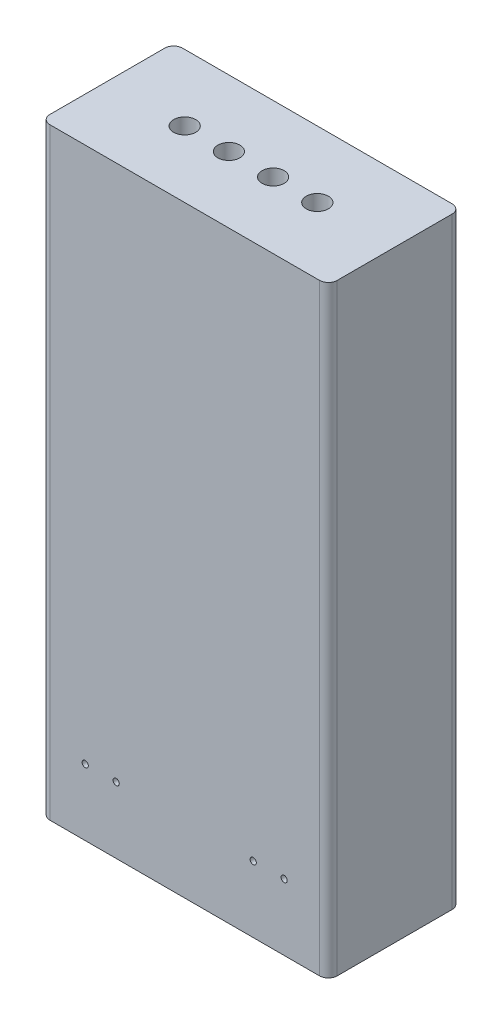
ISO-10303-21;
HEADER;
FILE_DESCRIPTION(('STEP AP214'),'2;1');
FILE_NAME('part.step','',(''),(''),'','','');
FILE_SCHEMA(('AUTOMOTIVE_DESIGN { 1 0 10303 214 1 1 1 1 }'));
ENDSEC;
DATA;
#1=APPLICATION_CONTEXT('core data for automotive mechanical design processes');
#2=APPLICATION_PROTOCOL_DEFINITION('international standard','automotive_design',2000,#1);
#3=PRODUCT_CONTEXT('',#1,'mechanical');
#4=PRODUCT('Part','Part','',(#3));
#5=PRODUCT_RELATED_PRODUCT_CATEGORY('part','',(#4));
#6=PRODUCT_DEFINITION_FORMATION('','',#4);
#7=PRODUCT_DEFINITION_CONTEXT('part definition',#1,'design');
#8=PRODUCT_DEFINITION('design','',#6,#7);
#9=PRODUCT_DEFINITION_SHAPE('','',#8);
#10=(LENGTH_UNIT() NAMED_UNIT(*) SI_UNIT(.MILLI.,.METRE.));
#11=(NAMED_UNIT(*) PLANE_ANGLE_UNIT() SI_UNIT($,.RADIAN.));
#12=(NAMED_UNIT(*) SI_UNIT($,.STERADIAN.) SOLID_ANGLE_UNIT());
#13=UNCERTAINTY_MEASURE_WITH_UNIT(LENGTH_MEASURE(1.E-05),#10,'distance_accuracy_value','');
#14=(GEOMETRIC_REPRESENTATION_CONTEXT(3) GLOBAL_UNCERTAINTY_ASSIGNED_CONTEXT((#13)) GLOBAL_UNIT_ASSIGNED_CONTEXT((#10,
#11,#12)) REPRESENTATION_CONTEXT('',''));
#15=CARTESIAN_POINT('',(0.,0.,0.));
#16=DIRECTION('',(0.,0.,1.));
#17=DIRECTION('',(1.,0.,0.));
#18=AXIS2_PLACEMENT_3D('',#15,#16,#17);
#19=CARTESIAN_POINT('',(41.275,-86.51875,19.05));
#20=DIRECTION('',(-1.,0.,0.));
#21=DIRECTION('',(0.,0.,1.));
#22=AXIS2_PLACEMENT_3D('',#19,#20,#21);
#23=PLANE('',#22);
#24=DIRECTION('',(0.,0.,-1.));
#25=VECTOR('',#24,1.);
#26=CARTESIAN_POINT('',(41.275,-86.51875,19.05));
#27=LINE('',#26,#25);
#28=CARTESIAN_POINT('',(41.275,-86.51875,16.51));
#29=VERTEX_POINT('',#28);
#30=CARTESIAN_POINT('',(41.275,-86.51875,-16.51));
#31=VERTEX_POINT('',#30);
#32=EDGE_CURVE('E167',#29,#31,#27,.T.);
#33=ORIENTED_EDGE('',*,*,#32,.T.);
#34=DIRECTION('',(0.,1.,0.));
#35=VECTOR('',#34,1.);
#36=CARTESIAN_POINT('',(41.275,86.51875,-16.51));
#37=LINE('',#36,#35);
#38=CARTESIAN_POINT('',(41.275,86.51875,-16.51));
#39=VERTEX_POINT('',#38);
#40=EDGE_CURVE('E123',#31,#39,#37,.T.);
#41=ORIENTED_EDGE('',*,*,#40,.T.);
#42=DIRECTION('',(0.,0.,-1.));
#43=VECTOR('',#42,1.);
#44=CARTESIAN_POINT('',(41.275,86.51875,19.05));
#45=LINE('',#44,#43);
#46=CARTESIAN_POINT('',(41.275,86.51875,16.51));
#47=VERTEX_POINT('',#46);
#48=EDGE_CURVE('E107',#47,#39,#45,.T.);
#49=ORIENTED_EDGE('',*,*,#48,.F.);
#50=DIRECTION('',(0.,1.,0.));
#51=VECTOR('',#50,1.);
#52=CARTESIAN_POINT('',(41.275,-86.51875,16.51));
#53=LINE('',#52,#51);
#54=EDGE_CURVE('E120',#47,#29,#53,.F.);
#55=ORIENTED_EDGE('',*,*,#54,.T.);
#56=EDGE_LOOP('',(#33,#41,#49,#55));
#57=FACE_BOUND('',#56,.T.);
#58=ADVANCED_FACE('F38',(#57),#23,.F.);
#59=CARTESIAN_POINT('',(-41.275,86.51875,19.05));
#60=DIRECTION('',(0.,-1.,0.));
#61=DIRECTION('',(0.,0.,-1.));
#62=AXIS2_PLACEMENT_3D('',#59,#60,#61);
#63=PLANE('',#62);
#64=CARTESIAN_POINT('',(-19.05,86.51875,0.));
#65=DIRECTION('',(0.,1.,0.));
#66=DIRECTION('',(0.,0.,1.));
#67=AXIS2_PLACEMENT_3D('',#64,#65,#66);
#68=CIRCLE('',#67,3.175);
#69=CARTESIAN_POINT('',(-19.05,86.51875,3.175));
#70=VERTEX_POINT('',#69);
#71=EDGE_CURVE('E378',#70,#70,#68,.T.);
#72=ORIENTED_EDGE('',*,*,#71,.F.);
#73=EDGE_LOOP('',(#72));
#74=FACE_BOUND('',#73,.T.);
#75=CARTESIAN_POINT('',(-6.35,86.51875,0.));
#76=DIRECTION('',(0.,1.,0.));
#77=DIRECTION('',(0.,0.,1.));
#78=AXIS2_PLACEMENT_3D('',#75,#76,#77);
#79=CIRCLE('',#78,3.175);
#80=CARTESIAN_POINT('',(-6.35,86.51875,3.175));
#81=VERTEX_POINT('',#80);
#82=EDGE_CURVE('E389',#81,#81,#79,.T.);
#83=ORIENTED_EDGE('',*,*,#82,.F.);
#84=EDGE_LOOP('',(#83));
#85=FACE_BOUND('',#84,.T.);
#86=CARTESIAN_POINT('',(6.35,86.51875,0.));
#87=DIRECTION('',(0.,1.,0.));
#88=DIRECTION('',(0.,0.,1.));
#89=AXIS2_PLACEMENT_3D('',#86,#87,#88);
#90=CIRCLE('',#89,3.175);
#91=CARTESIAN_POINT('',(6.35,86.51875,3.175));
#92=VERTEX_POINT('',#91);
#93=EDGE_CURVE('E395',#92,#92,#90,.T.);
#94=ORIENTED_EDGE('',*,*,#93,.F.);
#95=EDGE_LOOP('',(#94));
#96=FACE_BOUND('',#95,.T.);
#97=CARTESIAN_POINT('',(19.05,86.51875,0.));
#98=DIRECTION('',(0.,1.,0.));
#99=DIRECTION('',(0.,0.,1.));
#100=AXIS2_PLACEMENT_3D('',#97,#98,#99);
#101=CIRCLE('',#100,3.175);
#102=CARTESIAN_POINT('',(19.05,86.51875,3.175));
#103=VERTEX_POINT('',#102);
#104=EDGE_CURVE('E377',#103,#103,#101,.T.);
#105=ORIENTED_EDGE('',*,*,#104,.F.);
#106=EDGE_LOOP('',(#105));
#107=FACE_BOUND('',#106,.T.);
#108=ORIENTED_EDGE('',*,*,#48,.T.);
#109=CARTESIAN_POINT('',(38.735,86.51875,-16.51));
#110=DIRECTION('',(0.,-1.,0.));
#111=DIRECTION('',(0.,0.,-1.));
#112=AXIS2_PLACEMENT_3D('',#109,#110,#111);
#113=CIRCLE('',#112,2.54);
#114=CARTESIAN_POINT('',(38.735,86.51875,-19.05));
#115=VERTEX_POINT('',#114);
#116=EDGE_CURVE('E114',#39,#115,#113,.F.);
#117=ORIENTED_EDGE('',*,*,#116,.T.);
#118=DIRECTION('',(-1.,0.,0.));
#119=VECTOR('',#118,1.);
#120=CARTESIAN_POINT('',(-41.275,86.51875,-19.05));
#121=LINE('',#120,#119);
#122=CARTESIAN_POINT('',(-38.735,86.51875,-19.05));
#123=VERTEX_POINT('',#122);
#124=EDGE_CURVE('E174',#115,#123,#121,.T.);
#125=ORIENTED_EDGE('',*,*,#124,.T.);
#126=CARTESIAN_POINT('',(-38.735,86.51875,-16.51));
#127=DIRECTION('',(0.,-1.,0.));
#128=DIRECTION('',(0.,0.,-1.));
#129=AXIS2_PLACEMENT_3D('',#126,#127,#128);
#130=CIRCLE('',#129,2.54);
#131=CARTESIAN_POINT('',(-41.275,86.51875,-16.51));
#132=VERTEX_POINT('',#131);
#133=EDGE_CURVE('E115',#123,#132,#130,.F.);
#134=ORIENTED_EDGE('',*,*,#133,.T.);
#135=DIRECTION('',(0.,0.,-1.));
#136=VECTOR('',#135,1.);
#137=CARTESIAN_POINT('',(-41.275,86.51875,19.05));
#138=LINE('',#137,#136);
#139=CARTESIAN_POINT('',(-41.275,86.51875,16.51));
#140=VERTEX_POINT('',#139);
#141=EDGE_CURVE('E124',#140,#132,#138,.T.);
#142=ORIENTED_EDGE('',*,*,#141,.F.);
#143=CARTESIAN_POINT('',(-38.735,86.51875,16.51));
#144=DIRECTION('',(0.,-1.,0.));
#145=DIRECTION('',(0.,0.,-1.));
#146=AXIS2_PLACEMENT_3D('',#143,#144,#145);
#147=CIRCLE('',#146,2.54);
#148=CARTESIAN_POINT('',(-38.735,86.51875,19.05));
#149=VERTEX_POINT('',#148);
#150=EDGE_CURVE('E130',#140,#149,#147,.F.);
#151=ORIENTED_EDGE('',*,*,#150,.T.);
#152=DIRECTION('',(-1.,0.,0.));
#153=VECTOR('',#152,1.);
#154=CARTESIAN_POINT('',(-41.275,86.51875,19.05));
#155=LINE('',#154,#153);
#156=CARTESIAN_POINT('',(38.735,86.51875,19.05));
#157=VERTEX_POINT('',#156);
#158=EDGE_CURVE('E109',#157,#149,#155,.T.);
#159=ORIENTED_EDGE('',*,*,#158,.F.);
#160=CARTESIAN_POINT('',(38.735,86.51875,16.51));
#161=DIRECTION('',(0.,-1.,0.));
#162=DIRECTION('',(0.,0.,-1.));
#163=AXIS2_PLACEMENT_3D('',#160,#161,#162);
#164=CIRCLE('',#163,2.54);
#165=EDGE_CURVE('E104',#157,#47,#164,.F.);
#166=ORIENTED_EDGE('',*,*,#165,.T.);
#167=EDGE_LOOP('',(#108,#117,#125,#134,#142,#151,#159,#166));
#168=FACE_BOUND('',#167,.T.);
#169=ADVANCED_FACE('F106',(#74,#85,#96,#107,#168),#63,.F.);
#170=CARTESIAN_POINT('',(-41.275,-86.51875,19.05));
#171=DIRECTION('',(1.,0.,0.));
#172=DIRECTION('',(0.,0.,-1.));
#173=AXIS2_PLACEMENT_3D('',#170,#171,#172);
#174=PLANE('',#173);
#175=ORIENTED_EDGE('',*,*,#141,.T.);
#176=DIRECTION('',(0.,-1.,0.));
#177=VECTOR('',#176,1.);
#178=CARTESIAN_POINT('',(-41.275,-86.51875,-16.51));
#179=LINE('',#178,#177);
#180=CARTESIAN_POINT('',(-41.275,-86.51875,-16.51));
#181=VERTEX_POINT('',#180);
#182=EDGE_CURVE('E11',#132,#181,#179,.T.);
#183=ORIENTED_EDGE('',*,*,#182,.T.);
#184=DIRECTION('',(0.,0.,-1.));
#185=VECTOR('',#184,1.);
#186=CARTESIAN_POINT('',(-41.275,-86.51875,19.05));
#187=LINE('',#186,#185);
#188=CARTESIAN_POINT('',(-41.275,-86.51875,16.51));
#189=VERTEX_POINT('',#188);
#190=EDGE_CURVE('E155',#189,#181,#187,.T.);
#191=ORIENTED_EDGE('',*,*,#190,.F.);
#192=DIRECTION('',(0.,-1.,0.));
#193=VECTOR('',#192,1.);
#194=CARTESIAN_POINT('',(-41.275,-86.51875,16.51));
#195=LINE('',#194,#193);
#196=EDGE_CURVE('E46',#189,#140,#195,.F.);
#197=ORIENTED_EDGE('',*,*,#196,.T.);
#198=EDGE_LOOP('',(#175,#183,#191,#197));
#199=FACE_BOUND('',#198,.T.);
#200=ADVANCED_FACE('F154',(#199),#174,.F.);
#201=CARTESIAN_POINT('',(-41.275,-86.51875,19.05));
#202=DIRECTION('',(0.,1.,0.));
#203=DIRECTION('',(0.,0.,1.));
#204=AXIS2_PLACEMENT_3D('',#201,#202,#203);
#205=PLANE('',#204);
#206=DIRECTION('',(1.,0.,0.));
#207=VECTOR('',#206,1.);
#208=CARTESIAN_POINT('',(-41.275,-86.51875,-19.05));
#209=LINE('',#208,#207);
#210=CARTESIAN_POINT('',(-38.735,-86.51875,-19.05));
#211=VERTEX_POINT('',#210);
#212=CARTESIAN_POINT('',(38.735,-86.51875,-19.05));
#213=VERTEX_POINT('',#212);
#214=EDGE_CURVE('E170',#211,#213,#209,.T.);
#215=ORIENTED_EDGE('',*,*,#214,.T.);
#216=CARTESIAN_POINT('',(38.735,-86.51875,-16.51));
#217=DIRECTION('',(0.,1.,0.));
#218=DIRECTION('',(0.,0.,1.));
#219=AXIS2_PLACEMENT_3D('',#216,#217,#218);
#220=CIRCLE('',#219,2.54);
#221=EDGE_CURVE('E144',#213,#31,#220,.F.);
#222=ORIENTED_EDGE('',*,*,#221,.T.);
#223=ORIENTED_EDGE('',*,*,#32,.F.);
#224=CARTESIAN_POINT('',(38.735,-86.51875,16.51));
#225=DIRECTION('',(0.,1.,0.));
#226=DIRECTION('',(0.,0.,1.));
#227=AXIS2_PLACEMENT_3D('',#224,#225,#226);
#228=CIRCLE('',#227,2.54);
#229=CARTESIAN_POINT('',(38.735,-86.51875,19.05));
#230=VERTEX_POINT('',#229);
#231=EDGE_CURVE('E128',#29,#230,#228,.F.);
#232=ORIENTED_EDGE('',*,*,#231,.T.);
#233=DIRECTION('',(1.,0.,0.));
#234=VECTOR('',#233,1.);
#235=CARTESIAN_POINT('',(-41.275,-86.51875,19.05));
#236=LINE('',#235,#234);
#237=CARTESIAN_POINT('',(-38.735,-86.51875,19.05));
#238=VERTEX_POINT('',#237);
#239=EDGE_CURVE('E164',#238,#230,#236,.T.);
#240=ORIENTED_EDGE('',*,*,#239,.F.);
#241=CARTESIAN_POINT('',(-38.735,-86.51875,16.51));
#242=DIRECTION('',(0.,1.,0.));
#243=DIRECTION('',(0.,0.,1.));
#244=AXIS2_PLACEMENT_3D('',#241,#242,#243);
#245=CIRCLE('',#244,2.54);
#246=EDGE_CURVE('E60',#238,#189,#245,.F.);
#247=ORIENTED_EDGE('',*,*,#246,.T.);
#248=ORIENTED_EDGE('',*,*,#190,.T.);
#249=CARTESIAN_POINT('',(-38.735,-86.51875,-16.51));
#250=DIRECTION('',(0.,1.,0.));
#251=DIRECTION('',(0.,0.,1.));
#252=AXIS2_PLACEMENT_3D('',#249,#250,#251);
#253=CIRCLE('',#252,2.54);
#254=EDGE_CURVE('E53',#181,#211,#253,.F.);
#255=ORIENTED_EDGE('',*,*,#254,.T.);
#256=EDGE_LOOP('',(#215,#222,#223,#232,#240,#247,#248,#255));
#257=FACE_BOUND('',#256,.T.);
#258=ADVANCED_FACE('F166',(#257),#205,.F.);
#259=CARTESIAN_POINT('',(0.,0.,19.05));
#260=DIRECTION('',(0.,0.,-1.));
#261=DIRECTION('',(-1.,0.,0.));
#262=AXIS2_PLACEMENT_3D('',#259,#260,#261);
#263=PLANE('',#262);
#264=CARTESIAN_POINT('',(-19.685,-67.46875,19.05));
#265=DIRECTION('',(0.,0.,1.));
#266=DIRECTION('',(1.,0.,0.));
#267=AXIS2_PLACEMENT_3D('',#264,#265,#266);
#268=CIRCLE('',#267,0.888999999999996);
#269=CARTESIAN_POINT('',(-18.796,-67.46875,19.05));
#270=VERTEX_POINT('',#269);
#271=EDGE_CURVE('E405',#270,#270,#268,.T.);
#272=ORIENTED_EDGE('',*,*,#271,.F.);
#273=EDGE_LOOP('',(#272));
#274=FACE_BOUND('',#273,.T.);
#275=CARTESIAN_POINT('',(28.575,-67.46875,19.05));
#276=DIRECTION('',(0.,0.,1.));
#277=DIRECTION('',(1.,0.,0.));
#278=AXIS2_PLACEMENT_3D('',#275,#276,#277);
#279=CIRCLE('',#278,0.888999999999996);
#280=CARTESIAN_POINT('',(29.464,-67.46875,19.05));
#281=VERTEX_POINT('',#280);
#282=EDGE_CURVE('E411',#281,#281,#279,.T.);
#283=ORIENTED_EDGE('',*,*,#282,.F.);
#284=EDGE_LOOP('',(#283));
#285=FACE_BOUND('',#284,.T.);
#286=CARTESIAN_POINT('',(19.685,-67.46875,19.05));
#287=DIRECTION('',(0.,0.,1.));
#288=DIRECTION('',(1.,0.,0.));
#289=AXIS2_PLACEMENT_3D('',#286,#287,#288);
#290=CIRCLE('',#289,0.888999999999999);
#291=CARTESIAN_POINT('',(20.574,-67.46875,19.05));
#292=VERTEX_POINT('',#291);
#293=EDGE_CURVE('E399',#292,#292,#290,.T.);
#294=ORIENTED_EDGE('',*,*,#293,.F.);
#295=EDGE_LOOP('',(#294));
#296=FACE_BOUND('',#295,.T.);
#297=CARTESIAN_POINT('',(-28.575,-67.46875,19.05));
#298=DIRECTION('',(0.,0.,1.));
#299=DIRECTION('',(1.,0.,0.));
#300=AXIS2_PLACEMENT_3D('',#297,#298,#299);
#301=CIRCLE('',#300,0.888999999999996);
#302=CARTESIAN_POINT('',(-27.686,-67.46875,19.05));
#303=VERTEX_POINT('',#302);
#304=EDGE_CURVE('E404',#303,#303,#301,.T.);
#305=ORIENTED_EDGE('',*,*,#304,.F.);
#306=EDGE_LOOP('',(#305));
#307=FACE_BOUND('',#306,.T.);
#308=ORIENTED_EDGE('',*,*,#239,.T.);
#309=DIRECTION('',(0.,1.,0.));
#310=VECTOR('',#309,1.);
#311=CARTESIAN_POINT('',(38.735,0.,19.05));
#312=LINE('',#311,#310);
#313=EDGE_CURVE('E149',#230,#157,#312,.T.);
#314=ORIENTED_EDGE('',*,*,#313,.T.);
#315=ORIENTED_EDGE('',*,*,#158,.T.);
#316=DIRECTION('',(0.,-1.,0.));
#317=VECTOR('',#316,1.);
#318=CARTESIAN_POINT('',(-38.735,0.,19.05));
#319=LINE('',#318,#317);
#320=EDGE_CURVE('E146',#149,#238,#319,.T.);
#321=ORIENTED_EDGE('',*,*,#320,.T.);
#322=EDGE_LOOP('',(#308,#314,#315,#321));
#323=FACE_BOUND('',#322,.T.);
#324=ADVANCED_FACE('F163',(#274,#285,#296,#307,#323),#263,.F.);
#325=CARTESIAN_POINT('',(0.,0.,-19.05));
#326=DIRECTION('',(0.,0.,-1.));
#327=DIRECTION('',(-1.,0.,0.));
#328=AXIS2_PLACEMENT_3D('',#325,#326,#327);
#329=PLANE('',#328);
#330=CARTESIAN_POINT('',(-19.685,-67.46875,-19.05));
#331=DIRECTION('',(0.,0.,1.));
#332=DIRECTION('',(1.,0.,0.));
#333=AXIS2_PLACEMENT_3D('',#330,#331,#332);
#334=CIRCLE('',#333,0.888999999999996);
#335=CARTESIAN_POINT('',(-18.796,-67.46875,-19.05));
#336=VERTEX_POINT('',#335);
#337=EDGE_CURVE('E401',#336,#336,#334,.T.);
#338=ORIENTED_EDGE('',*,*,#337,.T.);
#339=EDGE_LOOP('',(#338));
#340=FACE_BOUND('',#339,.T.);
#341=CARTESIAN_POINT('',(28.575,-67.46875,-19.05));
#342=DIRECTION('',(0.,0.,1.));
#343=DIRECTION('',(1.,0.,0.));
#344=AXIS2_PLACEMENT_3D('',#341,#342,#343);
#345=CIRCLE('',#344,0.888999999999996);
#346=CARTESIAN_POINT('',(29.464,-67.46875,-19.05));
#347=VERTEX_POINT('',#346);
#348=EDGE_CURVE('E408',#347,#347,#345,.T.);
#349=ORIENTED_EDGE('',*,*,#348,.T.);
#350=EDGE_LOOP('',(#349));
#351=FACE_BOUND('',#350,.T.);
#352=CARTESIAN_POINT('',(19.685,-67.46875,-19.05));
#353=DIRECTION('',(0.,0.,1.));
#354=DIRECTION('',(1.,0.,0.));
#355=AXIS2_PLACEMENT_3D('',#352,#353,#354);
#356=CIRCLE('',#355,0.888999999999999);
#357=CARTESIAN_POINT('',(20.574,-67.46875,-19.05));
#358=VERTEX_POINT('',#357);
#359=EDGE_CURVE('E414',#358,#358,#356,.T.);
#360=ORIENTED_EDGE('',*,*,#359,.T.);
#361=EDGE_LOOP('',(#360));
#362=FACE_BOUND('',#361,.T.);
#363=CARTESIAN_POINT('',(-28.575,-67.46875,-19.05));
#364=DIRECTION('',(0.,0.,1.));
#365=DIRECTION('',(1.,0.,0.));
#366=AXIS2_PLACEMENT_3D('',#363,#364,#365);
#367=CIRCLE('',#366,0.888999999999996);
#368=CARTESIAN_POINT('',(-27.686,-67.46875,-19.05));
#369=VERTEX_POINT('',#368);
#370=EDGE_CURVE('E176',#369,#369,#367,.T.);
#371=ORIENTED_EDGE('',*,*,#370,.T.);
#372=EDGE_LOOP('',(#371));
#373=FACE_BOUND('',#372,.T.);
#374=ORIENTED_EDGE('',*,*,#124,.F.);
#375=DIRECTION('',(0.,1.,0.));
#376=VECTOR('',#375,1.);
#377=CARTESIAN_POINT('',(38.735,-86.51875,-19.05));
#378=LINE('',#377,#376);
#379=EDGE_CURVE('E139',#115,#213,#378,.F.);
#380=ORIENTED_EDGE('',*,*,#379,.T.);
#381=ORIENTED_EDGE('',*,*,#214,.F.);
#382=DIRECTION('',(0.,-1.,0.));
#383=VECTOR('',#382,1.);
#384=CARTESIAN_POINT('',(-38.735,86.51875,-19.05));
#385=LINE('',#384,#383);
#386=EDGE_CURVE('E137',#211,#123,#385,.F.);
#387=ORIENTED_EDGE('',*,*,#386,.T.);
#388=EDGE_LOOP('',(#374,#380,#381,#387));
#389=FACE_BOUND('',#388,.T.);
#390=ADVANCED_FACE('F182',(#340,#351,#362,#373,#389),#329,.T.);
#391=CARTESIAN_POINT('',(-28.575,-67.46875,-19.05));
#392=DIRECTION('',(0.,0.,1.));
#393=DIRECTION('',(1.,0.,0.));
#394=AXIS2_PLACEMENT_3D('',#391,#392,#393);
#395=CYLINDRICAL_SURFACE('',#394,0.888999999999996);
#396=CARTESIAN_POINT('',(-27.686,-67.46875,-19.05));
#397=CARTESIAN_POINT('',(-27.686,-67.46875,-18.653125));
#398=CARTESIAN_POINT('',(-27.686,-67.46875,-18.25625));
#399=CARTESIAN_POINT('',(-27.686,-67.46875,-17.4625));
#400=CARTESIAN_POINT('',(-27.686,-67.46875,-17.065625));
#401=CARTESIAN_POINT('',(-27.686,-67.46875,-16.271875));
#402=CARTESIAN_POINT('',(-27.686,-67.46875,-15.875));
#403=CARTESIAN_POINT('',(-27.686,-67.46875,-15.08125));
#404=CARTESIAN_POINT('',(-27.686,-67.46875,-14.684375));
#405=CARTESIAN_POINT('',(-27.686,-67.46875,-13.890625));
#406=CARTESIAN_POINT('',(-27.686,-67.46875,-13.49375));
#407=CARTESIAN_POINT('',(-27.686,-67.46875,-12.7));
#408=CARTESIAN_POINT('',(-27.686,-67.46875,-12.303125));
#409=CARTESIAN_POINT('',(-27.686,-67.46875,-11.509375));
#410=CARTESIAN_POINT('',(-27.686,-67.46875,-11.1125));
#411=CARTESIAN_POINT('',(-27.686,-67.46875,-10.31875));
#412=CARTESIAN_POINT('',(-27.686,-67.46875,-9.921875));
#413=CARTESIAN_POINT('',(-27.686,-67.46875,-9.128125));
#414=CARTESIAN_POINT('',(-27.686,-67.46875,-8.73125));
#415=CARTESIAN_POINT('',(-27.686,-67.46875,-7.9375));
#416=CARTESIAN_POINT('',(-27.686,-67.46875,-7.540625));
#417=CARTESIAN_POINT('',(-27.686,-67.46875,-6.746875));
#418=CARTESIAN_POINT('',(-27.686,-67.46875,-6.35));
#419=CARTESIAN_POINT('',(-27.686,-67.46875,-5.55625));
#420=CARTESIAN_POINT('',(-27.686,-67.46875,-5.159375));
#421=CARTESIAN_POINT('',(-27.686,-67.46875,-4.365625));
#422=CARTESIAN_POINT('',(-27.686,-67.46875,-3.96875));
#423=CARTESIAN_POINT('',(-27.686,-67.46875,-3.175));
#424=CARTESIAN_POINT('',(-27.686,-67.46875,-2.778125));
#425=CARTESIAN_POINT('',(-27.686,-67.46875,-1.984375));
#426=CARTESIAN_POINT('',(-27.686,-67.46875,-1.5875));
#427=CARTESIAN_POINT('',(-27.686,-67.46875,-0.79375));
#428=CARTESIAN_POINT('',(-27.686,-67.46875,-0.396875));
#429=CARTESIAN_POINT('',(-27.686,-67.46875,0.396875));
#430=CARTESIAN_POINT('',(-27.686,-67.46875,0.79375));
#431=CARTESIAN_POINT('',(-27.686,-67.46875,1.5875));
#432=CARTESIAN_POINT('',(-27.686,-67.46875,1.984375));
#433=CARTESIAN_POINT('',(-27.686,-67.46875,2.778125));
#434=CARTESIAN_POINT('',(-27.686,-67.46875,3.175));
#435=CARTESIAN_POINT('',(-27.686,-67.46875,3.96875));
#436=CARTESIAN_POINT('',(-27.686,-67.46875,4.365625));
#437=CARTESIAN_POINT('',(-27.686,-67.46875,5.159375));
#438=CARTESIAN_POINT('',(-27.686,-67.46875,5.55625));
#439=CARTESIAN_POINT('',(-27.686,-67.46875,6.35));
#440=CARTESIAN_POINT('',(-27.686,-67.46875,6.746875));
#441=CARTESIAN_POINT('',(-27.686,-67.46875,7.540625));
#442=CARTESIAN_POINT('',(-27.686,-67.46875,7.9375));
#443=CARTESIAN_POINT('',(-27.686,-67.46875,8.73125));
#444=CARTESIAN_POINT('',(-27.686,-67.46875,9.128125));
#445=CARTESIAN_POINT('',(-27.686,-67.46875,9.921875));
#446=CARTESIAN_POINT('',(-27.686,-67.46875,10.31875));
#447=CARTESIAN_POINT('',(-27.686,-67.46875,11.1125));
#448=CARTESIAN_POINT('',(-27.686,-67.46875,11.509375));
#449=CARTESIAN_POINT('',(-27.686,-67.46875,12.303125));
#450=CARTESIAN_POINT('',(-27.686,-67.46875,12.7));
#451=CARTESIAN_POINT('',(-27.686,-67.46875,13.49375));
#452=CARTESIAN_POINT('',(-27.686,-67.46875,13.890625));
#453=CARTESIAN_POINT('',(-27.686,-67.46875,14.684375));
#454=CARTESIAN_POINT('',(-27.686,-67.46875,15.08125));
#455=CARTESIAN_POINT('',(-27.686,-67.46875,15.875));
#456=CARTESIAN_POINT('',(-27.686,-67.46875,16.271875));
#457=CARTESIAN_POINT('',(-27.686,-67.46875,17.065625));
#458=CARTESIAN_POINT('',(-27.686,-67.46875,17.4625));
#459=CARTESIAN_POINT('',(-27.686,-67.46875,18.25625));
#460=CARTESIAN_POINT('',(-27.686,-67.46875,18.653125));
#461=CARTESIAN_POINT('',(-27.686,-67.46875,19.05));
#462=B_SPLINE_CURVE_WITH_KNOTS('',3,(#396,#397,#398,#399,#400,#401,#402,#403,#404,#405,#406,
#407,#408,#409,#410,#411,#412,#413,#414,#415,#416,#417,#418,#419,#420,#421,#422,#423,#424,#425,
#426,#427,#428,#429,#430,#431,#432,#433,#434,#435,#436,#437,#438,#439,#440,#441,#442,#443,#444,
#445,#446,#447,#448,#449,#450,#451,#452,#453,#454,#455,#456,#457,#458,#459,#460,#461),
.UNSPECIFIED.,.F.,.F.,(4,2,2,2,2,2,2,2,2,2,2,2,2,2,2,2,2,2,2,2,2,2,2,2,2,2,2,2,2,2,2,2,4),(0.,
1.190625,2.38125,3.571875,4.7625,5.953125,7.14375,8.334375,9.525,10.715625,11.90625,13.096875,
14.2875,15.478125,16.66875,17.859375,19.05,20.240625,21.43125,22.621875,23.8125,25.003125,
26.19375,27.384375,28.575,29.765625,30.95625,32.146875,33.3375,34.528125,35.71875,36.909375,
38.1),.UNSPECIFIED.);
#463=EDGE_CURVE('BSEAM224',#369,#303,#462,.T.);
#464=ORIENTED_EDGE('',*,*,#370,.F.);
#465=ORIENTED_EDGE('',*,*,#304,.T.);
#466=ORIENTED_EDGE('',*,*,#463,.T.);
#467=ORIENTED_EDGE('',*,*,#463,.F.);
#468=EDGE_LOOP('',(#464,#466,#465,#467));
#469=FACE_BOUND('',#468,.T.);
#470=ADVANCED_FACE('F224',(#469),#395,.F.);
#471=CARTESIAN_POINT('',(19.685,-67.46875,-19.05));
#472=DIRECTION('',(0.,0.,1.));
#473=DIRECTION('',(1.,0.,0.));
#474=AXIS2_PLACEMENT_3D('',#471,#472,#473);
#475=CYLINDRICAL_SURFACE('',#474,0.888999999999999);
#476=CARTESIAN_POINT('',(20.574,-67.46875,-19.05));
#477=CARTESIAN_POINT('',(20.574,-67.46875,-18.653125));
#478=CARTESIAN_POINT('',(20.574,-67.46875,-18.25625));
#479=CARTESIAN_POINT('',(20.574,-67.46875,-17.4625));
#480=CARTESIAN_POINT('',(20.574,-67.46875,-17.065625));
#481=CARTESIAN_POINT('',(20.574,-67.46875,-16.271875));
#482=CARTESIAN_POINT('',(20.574,-67.46875,-15.875));
#483=CARTESIAN_POINT('',(20.574,-67.46875,-15.08125));
#484=CARTESIAN_POINT('',(20.574,-67.46875,-14.684375));
#485=CARTESIAN_POINT('',(20.574,-67.46875,-13.890625));
#486=CARTESIAN_POINT('',(20.574,-67.46875,-13.49375));
#487=CARTESIAN_POINT('',(20.574,-67.46875,-12.7));
#488=CARTESIAN_POINT('',(20.574,-67.46875,-12.303125));
#489=CARTESIAN_POINT('',(20.574,-67.46875,-11.509375));
#490=CARTESIAN_POINT('',(20.574,-67.46875,-11.1125));
#491=CARTESIAN_POINT('',(20.574,-67.46875,-10.31875));
#492=CARTESIAN_POINT('',(20.574,-67.46875,-9.921875));
#493=CARTESIAN_POINT('',(20.574,-67.46875,-9.128125));
#494=CARTESIAN_POINT('',(20.574,-67.46875,-8.73125));
#495=CARTESIAN_POINT('',(20.574,-67.46875,-7.9375));
#496=CARTESIAN_POINT('',(20.574,-67.46875,-7.540625));
#497=CARTESIAN_POINT('',(20.574,-67.46875,-6.746875));
#498=CARTESIAN_POINT('',(20.574,-67.46875,-6.35));
#499=CARTESIAN_POINT('',(20.574,-67.46875,-5.55625));
#500=CARTESIAN_POINT('',(20.574,-67.46875,-5.159375));
#501=CARTESIAN_POINT('',(20.574,-67.46875,-4.365625));
#502=CARTESIAN_POINT('',(20.574,-67.46875,-3.96875));
#503=CARTESIAN_POINT('',(20.574,-67.46875,-3.175));
#504=CARTESIAN_POINT('',(20.574,-67.46875,-2.778125));
#505=CARTESIAN_POINT('',(20.574,-67.46875,-1.984375));
#506=CARTESIAN_POINT('',(20.574,-67.46875,-1.5875));
#507=CARTESIAN_POINT('',(20.574,-67.46875,-0.79375));
#508=CARTESIAN_POINT('',(20.574,-67.46875,-0.396875));
#509=CARTESIAN_POINT('',(20.574,-67.46875,0.396875));
#510=CARTESIAN_POINT('',(20.574,-67.46875,0.79375));
#511=CARTESIAN_POINT('',(20.574,-67.46875,1.5875));
#512=CARTESIAN_POINT('',(20.574,-67.46875,1.984375));
#513=CARTESIAN_POINT('',(20.574,-67.46875,2.778125));
#514=CARTESIAN_POINT('',(20.574,-67.46875,3.175));
#515=CARTESIAN_POINT('',(20.574,-67.46875,3.96875));
#516=CARTESIAN_POINT('',(20.574,-67.46875,4.365625));
#517=CARTESIAN_POINT('',(20.574,-67.46875,5.159375));
#518=CARTESIAN_POINT('',(20.574,-67.46875,5.55625));
#519=CARTESIAN_POINT('',(20.574,-67.46875,6.35));
#520=CARTESIAN_POINT('',(20.574,-67.46875,6.746875));
#521=CARTESIAN_POINT('',(20.574,-67.46875,7.540625));
#522=CARTESIAN_POINT('',(20.574,-67.46875,7.9375));
#523=CARTESIAN_POINT('',(20.574,-67.46875,8.73125));
#524=CARTESIAN_POINT('',(20.574,-67.46875,9.128125));
#525=CARTESIAN_POINT('',(20.574,-67.46875,9.921875));
#526=CARTESIAN_POINT('',(20.574,-67.46875,10.31875));
#527=CARTESIAN_POINT('',(20.574,-67.46875,11.1125));
#528=CARTESIAN_POINT('',(20.574,-67.46875,11.509375));
#529=CARTESIAN_POINT('',(20.574,-67.46875,12.303125));
#530=CARTESIAN_POINT('',(20.574,-67.46875,12.7));
#531=CARTESIAN_POINT('',(20.574,-67.46875,13.49375));
#532=CARTESIAN_POINT('',(20.574,-67.46875,13.890625));
#533=CARTESIAN_POINT('',(20.574,-67.46875,14.684375));
#534=CARTESIAN_POINT('',(20.574,-67.46875,15.08125));
#535=CARTESIAN_POINT('',(20.574,-67.46875,15.875));
#536=CARTESIAN_POINT('',(20.574,-67.46875,16.271875));
#537=CARTESIAN_POINT('',(20.574,-67.46875,17.065625));
#538=CARTESIAN_POINT('',(20.574,-67.46875,17.4625));
#539=CARTESIAN_POINT('',(20.574,-67.46875,18.25625));
#540=CARTESIAN_POINT('',(20.574,-67.46875,18.653125));
#541=CARTESIAN_POINT('',(20.574,-67.46875,19.05));
#542=B_SPLINE_CURVE_WITH_KNOTS('',3,(#476,#477,#478,#479,#480,#481,#482,#483,#484,#485,#486,
#487,#488,#489,#490,#491,#492,#493,#494,#495,#496,#497,#498,#499,#500,#501,#502,#503,#504,#505,
#506,#507,#508,#509,#510,#511,#512,#513,#514,#515,#516,#517,#518,#519,#520,#521,#522,#523,#524,
#525,#526,#527,#528,#529,#530,#531,#532,#533,#534,#535,#536,#537,#538,#539,#540,#541),
.UNSPECIFIED.,.F.,.F.,(4,2,2,2,2,2,2,2,2,2,2,2,2,2,2,2,2,2,2,2,2,2,2,2,2,2,2,2,2,2,2,2,4),(0.,
1.190625,2.38125,3.571875,4.7625,5.953125,7.14375,8.334375,9.525,10.715625,11.90625,13.096875,
14.2875,15.478125,16.66875,17.859375,19.05,20.240625,21.43125,22.621875,23.8125,25.003125,
26.19375,27.384375,28.575,29.765625,30.95625,32.146875,33.3375,34.528125,35.71875,36.909375,
38.1),.UNSPECIFIED.);
#543=EDGE_CURVE('BSEAM214',#358,#292,#542,.T.);
#544=ORIENTED_EDGE('',*,*,#359,.F.);
#545=ORIENTED_EDGE('',*,*,#293,.T.);
#546=ORIENTED_EDGE('',*,*,#543,.T.);
#547=ORIENTED_EDGE('',*,*,#543,.F.);
#548=EDGE_LOOP('',(#544,#546,#545,#547));
#549=FACE_BOUND('',#548,.T.);
#550=ADVANCED_FACE('F214',(#549),#475,.F.);
#551=CARTESIAN_POINT('',(28.575,-67.46875,-19.05));
#552=DIRECTION('',(0.,0.,1.));
#553=DIRECTION('',(1.,0.,0.));
#554=AXIS2_PLACEMENT_3D('',#551,#552,#553);
#555=CYLINDRICAL_SURFACE('',#554,0.888999999999996);
#556=CARTESIAN_POINT('',(29.464,-67.46875,-19.05));
#557=CARTESIAN_POINT('',(29.464,-67.46875,-18.653125));
#558=CARTESIAN_POINT('',(29.464,-67.46875,-18.25625));
#559=CARTESIAN_POINT('',(29.464,-67.46875,-17.4625));
#560=CARTESIAN_POINT('',(29.464,-67.46875,-17.065625));
#561=CARTESIAN_POINT('',(29.464,-67.46875,-16.271875));
#562=CARTESIAN_POINT('',(29.464,-67.46875,-15.875));
#563=CARTESIAN_POINT('',(29.464,-67.46875,-15.08125));
#564=CARTESIAN_POINT('',(29.464,-67.46875,-14.684375));
#565=CARTESIAN_POINT('',(29.464,-67.46875,-13.890625));
#566=CARTESIAN_POINT('',(29.464,-67.46875,-13.49375));
#567=CARTESIAN_POINT('',(29.464,-67.46875,-12.7));
#568=CARTESIAN_POINT('',(29.464,-67.46875,-12.303125));
#569=CARTESIAN_POINT('',(29.464,-67.46875,-11.509375));
#570=CARTESIAN_POINT('',(29.464,-67.46875,-11.1125));
#571=CARTESIAN_POINT('',(29.464,-67.46875,-10.31875));
#572=CARTESIAN_POINT('',(29.464,-67.46875,-9.921875));
#573=CARTESIAN_POINT('',(29.464,-67.46875,-9.128125));
#574=CARTESIAN_POINT('',(29.464,-67.46875,-8.73125));
#575=CARTESIAN_POINT('',(29.464,-67.46875,-7.9375));
#576=CARTESIAN_POINT('',(29.464,-67.46875,-7.540625));
#577=CARTESIAN_POINT('',(29.464,-67.46875,-6.746875));
#578=CARTESIAN_POINT('',(29.464,-67.46875,-6.35));
#579=CARTESIAN_POINT('',(29.464,-67.46875,-5.55625));
#580=CARTESIAN_POINT('',(29.464,-67.46875,-5.159375));
#581=CARTESIAN_POINT('',(29.464,-67.46875,-4.365625));
#582=CARTESIAN_POINT('',(29.464,-67.46875,-3.96875));
#583=CARTESIAN_POINT('',(29.464,-67.46875,-3.175));
#584=CARTESIAN_POINT('',(29.464,-67.46875,-2.778125));
#585=CARTESIAN_POINT('',(29.464,-67.46875,-1.984375));
#586=CARTESIAN_POINT('',(29.464,-67.46875,-1.5875));
#587=CARTESIAN_POINT('',(29.464,-67.46875,-0.79375));
#588=CARTESIAN_POINT('',(29.464,-67.46875,-0.396875));
#589=CARTESIAN_POINT('',(29.464,-67.46875,0.396875));
#590=CARTESIAN_POINT('',(29.464,-67.46875,0.79375));
#591=CARTESIAN_POINT('',(29.464,-67.46875,1.5875));
#592=CARTESIAN_POINT('',(29.464,-67.46875,1.984375));
#593=CARTESIAN_POINT('',(29.464,-67.46875,2.778125));
#594=CARTESIAN_POINT('',(29.464,-67.46875,3.175));
#595=CARTESIAN_POINT('',(29.464,-67.46875,3.96875));
#596=CARTESIAN_POINT('',(29.464,-67.46875,4.365625));
#597=CARTESIAN_POINT('',(29.464,-67.46875,5.159375));
#598=CARTESIAN_POINT('',(29.464,-67.46875,5.55625));
#599=CARTESIAN_POINT('',(29.464,-67.46875,6.35));
#600=CARTESIAN_POINT('',(29.464,-67.46875,6.746875));
#601=CARTESIAN_POINT('',(29.464,-67.46875,7.540625));
#602=CARTESIAN_POINT('',(29.464,-67.46875,7.9375));
#603=CARTESIAN_POINT('',(29.464,-67.46875,8.73125));
#604=CARTESIAN_POINT('',(29.464,-67.46875,9.128125));
#605=CARTESIAN_POINT('',(29.464,-67.46875,9.921875));
#606=CARTESIAN_POINT('',(29.464,-67.46875,10.31875));
#607=CARTESIAN_POINT('',(29.464,-67.46875,11.1125));
#608=CARTESIAN_POINT('',(29.464,-67.46875,11.509375));
#609=CARTESIAN_POINT('',(29.464,-67.46875,12.303125));
#610=CARTESIAN_POINT('',(29.464,-67.46875,12.7));
#611=CARTESIAN_POINT('',(29.464,-67.46875,13.49375));
#612=CARTESIAN_POINT('',(29.464,-67.46875,13.890625));
#613=CARTESIAN_POINT('',(29.464,-67.46875,14.684375));
#614=CARTESIAN_POINT('',(29.464,-67.46875,15.08125));
#615=CARTESIAN_POINT('',(29.464,-67.46875,15.875));
#616=CARTESIAN_POINT('',(29.464,-67.46875,16.271875));
#617=CARTESIAN_POINT('',(29.464,-67.46875,17.065625));
#618=CARTESIAN_POINT('',(29.464,-67.46875,17.4625));
#619=CARTESIAN_POINT('',(29.464,-67.46875,18.25625));
#620=CARTESIAN_POINT('',(29.464,-67.46875,18.653125));
#621=CARTESIAN_POINT('',(29.464,-67.46875,19.05));
#622=B_SPLINE_CURVE_WITH_KNOTS('',3,(#556,#557,#558,#559,#560,#561,#562,#563,#564,#565,#566,
#567,#568,#569,#570,#571,#572,#573,#574,#575,#576,#577,#578,#579,#580,#581,#582,#583,#584,#585,
#586,#587,#588,#589,#590,#591,#592,#593,#594,#595,#596,#597,#598,#599,#600,#601,#602,#603,#604,
#605,#606,#607,#608,#609,#610,#611,#612,#613,#614,#615,#616,#617,#618,#619,#620,#621),
.UNSPECIFIED.,.F.,.F.,(4,2,2,2,2,2,2,2,2,2,2,2,2,2,2,2,2,2,2,2,2,2,2,2,2,2,2,2,2,2,2,2,4),(0.,
1.190625,2.38125,3.571875,4.7625,5.953125,7.14375,8.334375,9.525,10.715625,11.90625,13.096875,
14.2875,15.478125,16.66875,17.859375,19.05,20.240625,21.43125,22.621875,23.8125,25.003125,
26.19375,27.384375,28.575,29.765625,30.95625,32.146875,33.3375,34.528125,35.71875,36.909375,
38.1),.UNSPECIFIED.);
#623=EDGE_CURVE('BSEAM208',#347,#281,#622,.T.);
#624=ORIENTED_EDGE('',*,*,#348,.F.);
#625=ORIENTED_EDGE('',*,*,#282,.T.);
#626=ORIENTED_EDGE('',*,*,#623,.T.);
#627=ORIENTED_EDGE('',*,*,#623,.F.);
#628=EDGE_LOOP('',(#624,#626,#625,#627));
#629=FACE_BOUND('',#628,.T.);
#630=ADVANCED_FACE('F208',(#629),#555,.F.);
#631=CARTESIAN_POINT('',(-19.685,-67.46875,-19.05));
#632=DIRECTION('',(0.,0.,1.));
#633=DIRECTION('',(1.,0.,0.));
#634=AXIS2_PLACEMENT_3D('',#631,#632,#633);
#635=CYLINDRICAL_SURFACE('',#634,0.888999999999996);
#636=CARTESIAN_POINT('',(-18.796,-67.46875,-19.05));
#637=CARTESIAN_POINT('',(-18.796,-67.46875,-18.653125));
#638=CARTESIAN_POINT('',(-18.796,-67.46875,-18.25625));
#639=CARTESIAN_POINT('',(-18.796,-67.46875,-17.4625));
#640=CARTESIAN_POINT('',(-18.796,-67.46875,-17.065625));
#641=CARTESIAN_POINT('',(-18.796,-67.46875,-16.271875));
#642=CARTESIAN_POINT('',(-18.796,-67.46875,-15.875));
#643=CARTESIAN_POINT('',(-18.796,-67.46875,-15.08125));
#644=CARTESIAN_POINT('',(-18.796,-67.46875,-14.684375));
#645=CARTESIAN_POINT('',(-18.796,-67.46875,-13.890625));
#646=CARTESIAN_POINT('',(-18.796,-67.46875,-13.49375));
#647=CARTESIAN_POINT('',(-18.796,-67.46875,-12.7));
#648=CARTESIAN_POINT('',(-18.796,-67.46875,-12.303125));
#649=CARTESIAN_POINT('',(-18.796,-67.46875,-11.509375));
#650=CARTESIAN_POINT('',(-18.796,-67.46875,-11.1125));
#651=CARTESIAN_POINT('',(-18.796,-67.46875,-10.31875));
#652=CARTESIAN_POINT('',(-18.796,-67.46875,-9.921875));
#653=CARTESIAN_POINT('',(-18.796,-67.46875,-9.128125));
#654=CARTESIAN_POINT('',(-18.796,-67.46875,-8.73125));
#655=CARTESIAN_POINT('',(-18.796,-67.46875,-7.9375));
#656=CARTESIAN_POINT('',(-18.796,-67.46875,-7.540625));
#657=CARTESIAN_POINT('',(-18.796,-67.46875,-6.746875));
#658=CARTESIAN_POINT('',(-18.796,-67.46875,-6.35));
#659=CARTESIAN_POINT('',(-18.796,-67.46875,-5.55625));
#660=CARTESIAN_POINT('',(-18.796,-67.46875,-5.159375));
#661=CARTESIAN_POINT('',(-18.796,-67.46875,-4.365625));
#662=CARTESIAN_POINT('',(-18.796,-67.46875,-3.96875));
#663=CARTESIAN_POINT('',(-18.796,-67.46875,-3.175));
#664=CARTESIAN_POINT('',(-18.796,-67.46875,-2.778125));
#665=CARTESIAN_POINT('',(-18.796,-67.46875,-1.984375));
#666=CARTESIAN_POINT('',(-18.796,-67.46875,-1.5875));
#667=CARTESIAN_POINT('',(-18.796,-67.46875,-0.79375));
#668=CARTESIAN_POINT('',(-18.796,-67.46875,-0.396875));
#669=CARTESIAN_POINT('',(-18.796,-67.46875,0.396875));
#670=CARTESIAN_POINT('',(-18.796,-67.46875,0.79375));
#671=CARTESIAN_POINT('',(-18.796,-67.46875,1.5875));
#672=CARTESIAN_POINT('',(-18.796,-67.46875,1.984375));
#673=CARTESIAN_POINT('',(-18.796,-67.46875,2.778125));
#674=CARTESIAN_POINT('',(-18.796,-67.46875,3.175));
#675=CARTESIAN_POINT('',(-18.796,-67.46875,3.96875));
#676=CARTESIAN_POINT('',(-18.796,-67.46875,4.365625));
#677=CARTESIAN_POINT('',(-18.796,-67.46875,5.159375));
#678=CARTESIAN_POINT('',(-18.796,-67.46875,5.55625));
#679=CARTESIAN_POINT('',(-18.796,-67.46875,6.35));
#680=CARTESIAN_POINT('',(-18.796,-67.46875,6.746875));
#681=CARTESIAN_POINT('',(-18.796,-67.46875,7.540625));
#682=CARTESIAN_POINT('',(-18.796,-67.46875,7.9375));
#683=CARTESIAN_POINT('',(-18.796,-67.46875,8.73125));
#684=CARTESIAN_POINT('',(-18.796,-67.46875,9.128125));
#685=CARTESIAN_POINT('',(-18.796,-67.46875,9.921875));
#686=CARTESIAN_POINT('',(-18.796,-67.46875,10.31875));
#687=CARTESIAN_POINT('',(-18.796,-67.46875,11.1125));
#688=CARTESIAN_POINT('',(-18.796,-67.46875,11.509375));
#689=CARTESIAN_POINT('',(-18.796,-67.46875,12.303125));
#690=CARTESIAN_POINT('',(-18.796,-67.46875,12.7));
#691=CARTESIAN_POINT('',(-18.796,-67.46875,13.49375));
#692=CARTESIAN_POINT('',(-18.796,-67.46875,13.890625));
#693=CARTESIAN_POINT('',(-18.796,-67.46875,14.684375));
#694=CARTESIAN_POINT('',(-18.796,-67.46875,15.08125));
#695=CARTESIAN_POINT('',(-18.796,-67.46875,15.875));
#696=CARTESIAN_POINT('',(-18.796,-67.46875,16.271875));
#697=CARTESIAN_POINT('',(-18.796,-67.46875,17.065625));
#698=CARTESIAN_POINT('',(-18.796,-67.46875,17.4625));
#699=CARTESIAN_POINT('',(-18.796,-67.46875,18.25625));
#700=CARTESIAN_POINT('',(-18.796,-67.46875,18.653125));
#701=CARTESIAN_POINT('',(-18.796,-67.46875,19.05));
#702=B_SPLINE_CURVE_WITH_KNOTS('',3,(#636,#637,#638,#639,#640,#641,#642,#643,#644,#645,#646,
#647,#648,#649,#650,#651,#652,#653,#654,#655,#656,#657,#658,#659,#660,#661,#662,#663,#664,#665,
#666,#667,#668,#669,#670,#671,#672,#673,#674,#675,#676,#677,#678,#679,#680,#681,#682,#683,#684,
#685,#686,#687,#688,#689,#690,#691,#692,#693,#694,#695,#696,#697,#698,#699,#700,#701),
.UNSPECIFIED.,.F.,.F.,(4,2,2,2,2,2,2,2,2,2,2,2,2,2,2,2,2,2,2,2,2,2,2,2,2,2,2,2,2,2,2,2,4),(0.,
1.190625,2.38125,3.571875,4.7625,5.953125,7.14375,8.334375,9.525,10.715625,11.90625,13.096875,
14.2875,15.478125,16.66875,17.859375,19.05,20.240625,21.43125,22.621875,23.8125,25.003125,
26.19375,27.384375,28.575,29.765625,30.95625,32.146875,33.3375,34.528125,35.71875,36.909375,
38.1),.UNSPECIFIED.);
#703=EDGE_CURVE('BSEAM203',#336,#270,#702,.T.);
#704=ORIENTED_EDGE('',*,*,#337,.F.);
#705=ORIENTED_EDGE('',*,*,#271,.T.);
#706=ORIENTED_EDGE('',*,*,#703,.T.);
#707=ORIENTED_EDGE('',*,*,#703,.F.);
#708=EDGE_LOOP('',(#704,#706,#705,#707));
#709=FACE_BOUND('',#708,.T.);
#710=ADVANCED_FACE('F203',(#709),#635,.F.);
#711=CARTESIAN_POINT('',(38.735,-86.51875,-16.51));
#712=DIRECTION('',(0.,-1.,0.));
#713=DIRECTION('',(0.,0.,-1.));
#714=AXIS2_PLACEMENT_3D('',#711,#712,#713);
#715=CYLINDRICAL_SURFACE('',#714,2.54);
#716=ORIENTED_EDGE('',*,*,#221,.F.);
#717=ORIENTED_EDGE('',*,*,#379,.F.);
#718=ORIENTED_EDGE('',*,*,#116,.F.);
#719=ORIENTED_EDGE('',*,*,#40,.F.);
#720=EDGE_LOOP('',(#716,#717,#718,#719));
#721=FACE_BOUND('',#720,.T.);
#722=ADVANCED_FACE('F191',(#721),#715,.T.);
#723=CARTESIAN_POINT('',(38.735,0.,16.51));
#724=DIRECTION('',(0.,1.,0.));
#725=DIRECTION('',(0.,0.,1.));
#726=AXIS2_PLACEMENT_3D('',#723,#724,#725);
#727=CYLINDRICAL_SURFACE('',#726,2.54);
#728=ORIENTED_EDGE('',*,*,#231,.F.);
#729=ORIENTED_EDGE('',*,*,#54,.F.);
#730=ORIENTED_EDGE('',*,*,#165,.F.);
#731=ORIENTED_EDGE('',*,*,#313,.F.);
#732=EDGE_LOOP('',(#728,#729,#730,#731));
#733=FACE_BOUND('',#732,.T.);
#734=ADVANCED_FACE('F127',(#733),#727,.T.);
#735=CARTESIAN_POINT('',(-38.735,-86.51875,-16.51));
#736=DIRECTION('',(0.,1.,0.));
#737=DIRECTION('',(0.,0.,1.));
#738=AXIS2_PLACEMENT_3D('',#735,#736,#737);
#739=CYLINDRICAL_SURFACE('',#738,2.54);
#740=ORIENTED_EDGE('',*,*,#133,.F.);
#741=ORIENTED_EDGE('',*,*,#386,.F.);
#742=ORIENTED_EDGE('',*,*,#254,.F.);
#743=ORIENTED_EDGE('',*,*,#182,.F.);
#744=EDGE_LOOP('',(#740,#741,#742,#743));
#745=FACE_BOUND('',#744,.T.);
#746=ADVANCED_FACE('F184',(#745),#739,.T.);
#747=CARTESIAN_POINT('',(-38.735,0.,16.51));
#748=DIRECTION('',(0.,-1.,0.));
#749=DIRECTION('',(0.,0.,-1.));
#750=AXIS2_PLACEMENT_3D('',#747,#748,#749);
#751=CYLINDRICAL_SURFACE('',#750,2.54);
#752=ORIENTED_EDGE('',*,*,#150,.F.);
#753=ORIENTED_EDGE('',*,*,#196,.F.);
#754=ORIENTED_EDGE('',*,*,#246,.F.);
#755=ORIENTED_EDGE('',*,*,#320,.F.);
#756=EDGE_LOOP('',(#752,#753,#754,#755));
#757=FACE_BOUND('',#756,.T.);
#758=ADVANCED_FACE('F40',(#757),#751,.T.);
#759=CARTESIAN_POINT('',(19.05,35.71875,0.));
#760=DIRECTION('',(0.,1.,0.));
#761=DIRECTION('',(0.,0.,1.));
#762=AXIS2_PLACEMENT_3D('',#759,#760,#761);
#763=CYLINDRICAL_SURFACE('',#762,3.175);
#764=CARTESIAN_POINT('',(19.05,35.71875,0.));
#765=DIRECTION('',(0.,1.,0.));
#766=DIRECTION('',(0.,0.,1.));
#767=AXIS2_PLACEMENT_3D('',#764,#765,#766);
#768=CIRCLE('',#767,3.175);
#769=CARTESIAN_POINT('',(19.05,35.71875,3.175));
#770=VERTEX_POINT('',#769);
#771=EDGE_CURVE('E381',#770,#770,#768,.T.);
#772=ORIENTED_EDGE('',*,*,#771,.F.);
#773=EDGE_LOOP('',(#772));
#774=FACE_BOUND('',#773,.T.);
#775=ORIENTED_EDGE('',*,*,#104,.T.);
#776=EDGE_LOOP('',(#775));
#777=FACE_BOUND('',#776,.T.);
#778=ADVANCED_FACE('F190',(#774,#777),#763,.F.);
#779=CARTESIAN_POINT('',(19.05,35.71875,0.));
#780=DIRECTION('',(0.,1.,0.));
#781=DIRECTION('',(0.,0.,1.));
#782=AXIS2_PLACEMENT_3D('',#779,#780,#781);
#783=PLANE('',#782);
#784=ORIENTED_EDGE('',*,*,#771,.T.);
#785=EDGE_LOOP('',(#784));
#786=FACE_BOUND('',#785,.T.);
#787=ADVANCED_FACE('F302',(#786),#783,.T.);
#788=CARTESIAN_POINT('',(6.35,35.71875,0.));
#789=DIRECTION('',(0.,1.,0.));
#790=DIRECTION('',(0.,0.,1.));
#791=AXIS2_PLACEMENT_3D('',#788,#789,#790);
#792=CYLINDRICAL_SURFACE('',#791,3.175);
#793=CARTESIAN_POINT('',(6.35,35.71875,0.));
#794=DIRECTION('',(0.,1.,0.));
#795=DIRECTION('',(0.,0.,1.));
#796=AXIS2_PLACEMENT_3D('',#793,#794,#795);
#797=CIRCLE('',#796,3.175);
#798=CARTESIAN_POINT('',(6.35,35.71875,3.175));
#799=VERTEX_POINT('',#798);
#800=EDGE_CURVE('E392',#799,#799,#797,.T.);
#801=ORIENTED_EDGE('',*,*,#800,.F.);
#802=EDGE_LOOP('',(#801));
#803=FACE_BOUND('',#802,.T.);
#804=ORIENTED_EDGE('',*,*,#93,.T.);
#805=EDGE_LOOP('',(#804));
#806=FACE_BOUND('',#805,.T.);
#807=ADVANCED_FACE('F311',(#803,#806),#792,.F.);
#808=CARTESIAN_POINT('',(6.35,35.71875,0.));
#809=DIRECTION('',(0.,1.,0.));
#810=DIRECTION('',(0.,0.,1.));
#811=AXIS2_PLACEMENT_3D('',#808,#809,#810);
#812=PLANE('',#811);
#813=ORIENTED_EDGE('',*,*,#800,.T.);
#814=EDGE_LOOP('',(#813));
#815=FACE_BOUND('',#814,.T.);
#816=ADVANCED_FACE('F320',(#815),#812,.T.);
#817=CARTESIAN_POINT('',(-6.35,35.71875,0.));
#818=DIRECTION('',(0.,1.,0.));
#819=DIRECTION('',(0.,0.,1.));
#820=AXIS2_PLACEMENT_3D('',#817,#818,#819);
#821=CYLINDRICAL_SURFACE('',#820,3.175);
#822=CARTESIAN_POINT('',(-6.35,35.71875,0.));
#823=DIRECTION('',(0.,1.,0.));
#824=DIRECTION('',(0.,0.,1.));
#825=AXIS2_PLACEMENT_3D('',#822,#823,#824);
#826=CIRCLE('',#825,3.175);
#827=CARTESIAN_POINT('',(-6.35,35.71875,3.175));
#828=VERTEX_POINT('',#827);
#829=EDGE_CURVE('E384',#828,#828,#826,.T.);
#830=ORIENTED_EDGE('',*,*,#829,.F.);
#831=EDGE_LOOP('',(#830));
#832=FACE_BOUND('',#831,.T.);
#833=ORIENTED_EDGE('',*,*,#82,.T.);
#834=EDGE_LOOP('',(#833));
#835=FACE_BOUND('',#834,.T.);
#836=ADVANCED_FACE('F330',(#832,#835),#821,.F.);
#837=CARTESIAN_POINT('',(-6.35,35.71875,0.));
#838=DIRECTION('',(0.,1.,0.));
#839=DIRECTION('',(0.,0.,1.));
#840=AXIS2_PLACEMENT_3D('',#837,#838,#839);
#841=PLANE('',#840);
#842=ORIENTED_EDGE('',*,*,#829,.T.);
#843=EDGE_LOOP('',(#842));
#844=FACE_BOUND('',#843,.T.);
#845=ADVANCED_FACE('F340',(#844),#841,.T.);
#846=CARTESIAN_POINT('',(-19.05,35.71875,0.));
#847=DIRECTION('',(0.,1.,0.));
#848=DIRECTION('',(0.,0.,1.));
#849=AXIS2_PLACEMENT_3D('',#846,#847,#848);
#850=CYLINDRICAL_SURFACE('',#849,3.175);
#851=CARTESIAN_POINT('',(-19.05,35.71875,0.));
#852=DIRECTION('',(0.,1.,0.));
#853=DIRECTION('',(0.,0.,1.));
#854=AXIS2_PLACEMENT_3D('',#851,#852,#853);
#855=CIRCLE('',#854,3.175);
#856=CARTESIAN_POINT('',(-19.05,35.71875,3.175));
#857=VERTEX_POINT('',#856);
#858=EDGE_CURVE('E376',#857,#857,#855,.T.);
#859=ORIENTED_EDGE('',*,*,#858,.F.);
#860=EDGE_LOOP('',(#859));
#861=FACE_BOUND('',#860,.T.);
#862=ORIENTED_EDGE('',*,*,#71,.T.);
#863=EDGE_LOOP('',(#862));
#864=FACE_BOUND('',#863,.T.);
#865=ADVANCED_FACE('F350',(#861,#864),#850,.F.);
#866=CARTESIAN_POINT('',(-19.05,35.71875,0.));
#867=DIRECTION('',(0.,1.,0.));
#868=DIRECTION('',(0.,0.,1.));
#869=AXIS2_PLACEMENT_3D('',#866,#867,#868);
#870=PLANE('',#869);
#871=ORIENTED_EDGE('',*,*,#858,.T.);
#872=EDGE_LOOP('',(#871));
#873=FACE_BOUND('',#872,.T.);
#874=ADVANCED_FACE('F360',(#873),#870,.T.);
#875=CLOSED_SHELL('',(#58,#169,#200,#258,#324,#390,#470,#550,#630,#710,#722,#734,#746,#758,#778,
#787,#807,#816,#836,#845,#865,#874));
#876=MANIFOLD_SOLID_BREP('B2',#875);
#877=ADVANCED_BREP_SHAPE_REPRESENTATION('',(#18,#876),#14);
#878=SHAPE_DEFINITION_REPRESENTATION(#9,#877);
ENDSEC;
END-ISO-10303-21;
